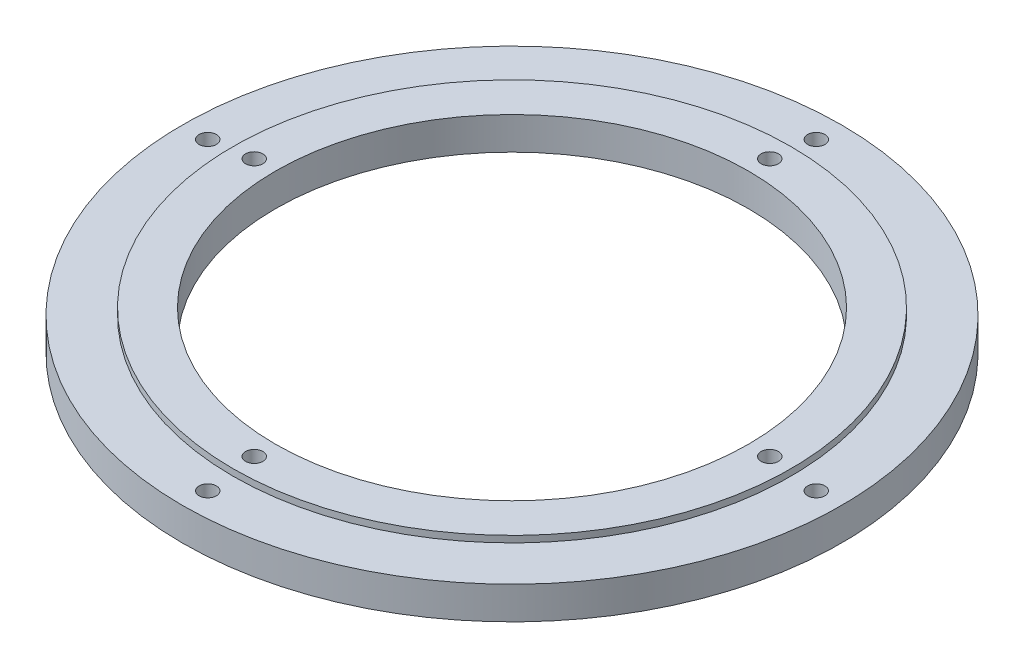
ISO-10303-21;
HEADER;
FILE_DESCRIPTION(('STEP AP214'),'2;1');
FILE_NAME('part.step','',(''),(''),'','','');
FILE_SCHEMA(('AUTOMOTIVE_DESIGN { 1 0 10303 214 1 1 1 1 }'));
ENDSEC;
DATA;
#1=APPLICATION_CONTEXT('core data for automotive mechanical design processes');
#2=APPLICATION_PROTOCOL_DEFINITION('international standard','automotive_design',2000,#1);
#3=PRODUCT_CONTEXT('',#1,'mechanical');
#4=PRODUCT('Part','Part','',(#3));
#5=PRODUCT_RELATED_PRODUCT_CATEGORY('part','',(#4));
#6=PRODUCT_DEFINITION_FORMATION('','',#4);
#7=PRODUCT_DEFINITION_CONTEXT('part definition',#1,'design');
#8=PRODUCT_DEFINITION('design','',#6,#7);
#9=PRODUCT_DEFINITION_SHAPE('','',#8);
#10=(LENGTH_UNIT() NAMED_UNIT(*) SI_UNIT(.MILLI.,.METRE.));
#11=(NAMED_UNIT(*) PLANE_ANGLE_UNIT() SI_UNIT($,.RADIAN.));
#12=(NAMED_UNIT(*) SI_UNIT($,.STERADIAN.) SOLID_ANGLE_UNIT());
#13=UNCERTAINTY_MEASURE_WITH_UNIT(LENGTH_MEASURE(1.E-05),#10,'distance_accuracy_value','');
#14=(GEOMETRIC_REPRESENTATION_CONTEXT(3) GLOBAL_UNCERTAINTY_ASSIGNED_CONTEXT((#13)) GLOBAL_UNIT_ASSIGNED_CONTEXT((#10,
#11,#12)) REPRESENTATION_CONTEXT('',''));
#15=CARTESIAN_POINT('',(0.,0.,0.));
#16=DIRECTION('',(0.,0.,1.));
#17=DIRECTION('',(1.,0.,0.));
#18=AXIS2_PLACEMENT_3D('',#15,#16,#17);
#19=CARTESIAN_POINT('',(0.,10.,0.));
#20=DIRECTION('',(0.,-1.,0.));
#21=DIRECTION('',(0.,0.,-1.));
#22=AXIS2_PLACEMENT_3D('',#19,#20,#21);
#23=CYLINDRICAL_SURFACE('',#22,85.5);
#24=CARTESIAN_POINT('',(0.,10.,0.));
#25=DIRECTION('',(0.,1.,0.));
#26=DIRECTION('',(0.,0.,1.));
#27=AXIS2_PLACEMENT_3D('',#24,#25,#26);
#28=CIRCLE('',#27,85.5);
#29=CARTESIAN_POINT('',(0.,10.,85.5));
#30=VERTEX_POINT('',#29);
#31=EDGE_CURVE('E53',#30,#30,#28,.T.);
#32=ORIENTED_EDGE('',*,*,#31,.F.);
#33=EDGE_LOOP('',(#32));
#34=FACE_BOUND('',#33,.T.);
#35=CARTESIAN_POINT('',(0.,8.,0.));
#36=DIRECTION('',(0.,-1.,0.));
#37=DIRECTION('',(0.,0.,-1.));
#38=AXIS2_PLACEMENT_3D('',#35,#36,#37);
#39=CIRCLE('',#38,85.5);
#40=CARTESIAN_POINT('',(0.,8.,-85.5));
#41=VERTEX_POINT('',#40);
#42=EDGE_CURVE('E10',#41,#41,#39,.T.);
#43=ORIENTED_EDGE('',*,*,#42,.F.);
#44=EDGE_LOOP('',(#43));
#45=FACE_BOUND('',#44,.T.);
#46=ADVANCED_FACE('F45',(#34,#45),#23,.T.);
#47=CARTESIAN_POINT('',(79.,10.,2.75827025768608E-13));
#48=DIRECTION('',(0.,-1.,0.));
#49=DIRECTION('',(0.,0.,-1.));
#50=AXIS2_PLACEMENT_3D('',#47,#48,#49);
#51=CYLINDRICAL_SURFACE('',#50,2.65);
#52=CARTESIAN_POINT('',(79.,10.,2.75827025768608E-13));
#53=DIRECTION('',(0.,1.,0.));
#54=DIRECTION('',(0.,0.,1.));
#55=AXIS2_PLACEMENT_3D('',#52,#53,#54);
#56=CIRCLE('',#55,2.65);
#57=CARTESIAN_POINT('',(79.,10.,2.65000000000027));
#58=VERTEX_POINT('',#57);
#59=EDGE_CURVE('E58',#58,#58,#56,.T.);
#60=ORIENTED_EDGE('',*,*,#59,.T.);
#61=EDGE_LOOP('',(#60));
#62=FACE_BOUND('',#61,.T.);
#63=CARTESIAN_POINT('',(79.,0.,2.75827025768608E-13));
#64=DIRECTION('',(0.,1.,0.));
#65=DIRECTION('',(0.,0.,1.));
#66=AXIS2_PLACEMENT_3D('',#63,#64,#65);
#67=CIRCLE('',#66,2.65);
#68=CARTESIAN_POINT('',(79.,0.,2.65000000000027));
#69=VERTEX_POINT('',#68);
#70=EDGE_CURVE('E85',#69,#69,#67,.T.);
#71=ORIENTED_EDGE('',*,*,#70,.F.);
#72=EDGE_LOOP('',(#71));
#73=FACE_BOUND('',#72,.T.);
#74=ADVANCED_FACE('F125',(#62,#73),#51,.F.);
#75=CARTESIAN_POINT('',(-5.51654051537215E-13,10.,79.));
#76=DIRECTION('',(0.,-1.,0.));
#77=DIRECTION('',(0.,0.,-1.));
#78=AXIS2_PLACEMENT_3D('',#75,#76,#77);
#79=CYLINDRICAL_SURFACE('',#78,2.65);
#80=CARTESIAN_POINT('',(-5.51654051537215E-13,10.,79.));
#81=DIRECTION('',(0.,1.,0.));
#82=DIRECTION('',(0.,0.,1.));
#83=AXIS2_PLACEMENT_3D('',#80,#81,#82);
#84=CIRCLE('',#83,2.65);
#85=CARTESIAN_POINT('',(-5.51654051537215E-13,10.,81.65));
#86=VERTEX_POINT('',#85);
#87=EDGE_CURVE('E64',#86,#86,#84,.T.);
#88=ORIENTED_EDGE('',*,*,#87,.T.);
#89=EDGE_LOOP('',(#88));
#90=FACE_BOUND('',#89,.T.);
#91=CARTESIAN_POINT('',(-5.51654051537215E-13,0.,79.));
#92=DIRECTION('',(0.,1.,0.));
#93=DIRECTION('',(0.,0.,1.));
#94=AXIS2_PLACEMENT_3D('',#91,#92,#93);
#95=CIRCLE('',#94,2.65);
#96=CARTESIAN_POINT('',(-5.51654051537215E-13,0.,81.65));
#97=VERTEX_POINT('',#96);
#98=EDGE_CURVE('E81',#97,#97,#95,.T.);
#99=ORIENTED_EDGE('',*,*,#98,.F.);
#100=EDGE_LOOP('',(#99));
#101=FACE_BOUND('',#100,.T.);
#102=ADVANCED_FACE('F114',(#90,#101),#79,.F.);
#103=CARTESIAN_POINT('',(-79.,10.,-8.27481077305823E-13));
#104=DIRECTION('',(0.,-1.,0.));
#105=DIRECTION('',(0.,0.,-1.));
#106=AXIS2_PLACEMENT_3D('',#103,#104,#105);
#107=CYLINDRICAL_SURFACE('',#106,2.65);
#108=CARTESIAN_POINT('',(-79.,10.,-8.27481077305823E-13));
#109=DIRECTION('',(0.,1.,0.));
#110=DIRECTION('',(0.,0.,1.));
#111=AXIS2_PLACEMENT_3D('',#108,#109,#110);
#112=CIRCLE('',#111,2.65);
#113=CARTESIAN_POINT('',(-79.,10.,2.64999999999917));
#114=VERTEX_POINT('',#113);
#115=EDGE_CURVE('E102',#114,#114,#112,.T.);
#116=ORIENTED_EDGE('',*,*,#115,.T.);
#117=EDGE_LOOP('',(#116));
#118=FACE_BOUND('',#117,.T.);
#119=CARTESIAN_POINT('',(-79.,0.,-8.27481077305823E-13));
#120=DIRECTION('',(0.,1.,0.));
#121=DIRECTION('',(0.,0.,1.));
#122=AXIS2_PLACEMENT_3D('',#119,#120,#121);
#123=CIRCLE('',#122,2.65);
#124=CARTESIAN_POINT('',(-79.,0.,2.64999999999917));
#125=VERTEX_POINT('',#124);
#126=EDGE_CURVE('E77',#125,#125,#123,.T.);
#127=ORIENTED_EDGE('',*,*,#126,.F.);
#128=EDGE_LOOP('',(#127));
#129=FACE_BOUND('',#128,.T.);
#130=ADVANCED_FACE('F152',(#118,#129),#107,.F.);
#131=CARTESIAN_POINT('',(0.,10.,-79.));
#132=DIRECTION('',(0.,-1.,0.));
#133=DIRECTION('',(0.,0.,-1.));
#134=AXIS2_PLACEMENT_3D('',#131,#132,#133);
#135=CYLINDRICAL_SURFACE('',#134,2.65);
#136=CARTESIAN_POINT('',(0.,10.,-79.));
#137=DIRECTION('',(0.,1.,0.));
#138=DIRECTION('',(0.,0.,1.));
#139=AXIS2_PLACEMENT_3D('',#136,#137,#138);
#140=CIRCLE('',#139,2.65);
#141=CARTESIAN_POINT('',(0.,10.,-76.35));
#142=VERTEX_POINT('',#141);
#143=EDGE_CURVE('E96',#142,#142,#140,.T.);
#144=ORIENTED_EDGE('',*,*,#143,.T.);
#145=EDGE_LOOP('',(#144));
#146=FACE_BOUND('',#145,.T.);
#147=CARTESIAN_POINT('',(0.,0.,-79.));
#148=DIRECTION('',(0.,1.,0.));
#149=DIRECTION('',(0.,0.,1.));
#150=AXIS2_PLACEMENT_3D('',#147,#148,#149);
#151=CIRCLE('',#150,2.65);
#152=CARTESIAN_POINT('',(0.,0.,-76.35));
#153=VERTEX_POINT('',#152);
#154=EDGE_CURVE('E72',#153,#153,#151,.T.);
#155=ORIENTED_EDGE('',*,*,#154,.F.);
#156=EDGE_LOOP('',(#155));
#157=FACE_BOUND('',#156,.T.);
#158=ADVANCED_FACE('F154',(#146,#157),#135,.F.);
#159=CARTESIAN_POINT('',(0.,10.,0.));
#160=DIRECTION('',(0.,-1.,0.));
#161=DIRECTION('',(0.,0.,-1.));
#162=AXIS2_PLACEMENT_3D('',#159,#160,#161);
#163=CYLINDRICAL_SURFACE('',#162,72.5);
#164=CARTESIAN_POINT('',(0.,10.,0.));
#165=DIRECTION('',(0.,1.,0.));
#166=DIRECTION('',(0.,0.,1.));
#167=AXIS2_PLACEMENT_3D('',#164,#165,#166);
#168=CIRCLE('',#167,72.5);
#169=CARTESIAN_POINT('',(0.,10.,72.5));
#170=VERTEX_POINT('',#169);
#171=EDGE_CURVE('E91',#170,#170,#168,.T.);
#172=ORIENTED_EDGE('',*,*,#171,.T.);
#173=EDGE_LOOP('',(#172));
#174=FACE_BOUND('',#173,.T.);
#175=CARTESIAN_POINT('',(0.,0.,0.));
#176=DIRECTION('',(0.,1.,0.));
#177=DIRECTION('',(0.,0.,1.));
#178=AXIS2_PLACEMENT_3D('',#175,#176,#177);
#179=CIRCLE('',#178,72.5);
#180=CARTESIAN_POINT('',(0.,0.,72.5));
#181=VERTEX_POINT('',#180);
#182=EDGE_CURVE('E68',#181,#181,#179,.T.);
#183=ORIENTED_EDGE('',*,*,#182,.F.);
#184=EDGE_LOOP('',(#183));
#185=FACE_BOUND('',#184,.T.);
#186=ADVANCED_FACE('F47',(#174,#185),#163,.F.);
#187=CARTESIAN_POINT('',(0.,10.,0.));
#188=DIRECTION('',(0.,1.,0.));
#189=DIRECTION('',(0.,0.,1.));
#190=AXIS2_PLACEMENT_3D('',#187,#188,#189);
#191=PLANE('',#190);
#192=ORIENTED_EDGE('',*,*,#171,.F.);
#193=EDGE_LOOP('',(#192));
#194=FACE_BOUND('',#193,.T.);
#195=ORIENTED_EDGE('',*,*,#143,.F.);
#196=EDGE_LOOP('',(#195));
#197=FACE_BOUND('',#196,.T.);
#198=ORIENTED_EDGE('',*,*,#115,.F.);
#199=EDGE_LOOP('',(#198));
#200=FACE_BOUND('',#199,.T.);
#201=ORIENTED_EDGE('',*,*,#87,.F.);
#202=EDGE_LOOP('',(#201));
#203=FACE_BOUND('',#202,.T.);
#204=ORIENTED_EDGE('',*,*,#59,.F.);
#205=EDGE_LOOP('',(#204));
#206=FACE_BOUND('',#205,.T.);
#207=ORIENTED_EDGE('',*,*,#31,.T.);
#208=EDGE_LOOP('',(#207));
#209=FACE_BOUND('',#208,.T.);
#210=ADVANCED_FACE('F117',(#194,#197,#200,#203,#206,#209),#191,.T.);
#211=CARTESIAN_POINT('',(0.,0.,0.));
#212=DIRECTION('',(0.,1.,0.));
#213=DIRECTION('',(0.,0.,1.));
#214=AXIS2_PLACEMENT_3D('',#211,#212,#213);
#215=PLANE('',#214);
#216=ORIENTED_EDGE('',*,*,#182,.T.);
#217=EDGE_LOOP('',(#216));
#218=FACE_BOUND('',#217,.T.);
#219=ORIENTED_EDGE('',*,*,#154,.T.);
#220=EDGE_LOOP('',(#219));
#221=FACE_BOUND('',#220,.T.);
#222=ORIENTED_EDGE('',*,*,#126,.T.);
#223=EDGE_LOOP('',(#222));
#224=FACE_BOUND('',#223,.T.);
#225=ORIENTED_EDGE('',*,*,#98,.T.);
#226=EDGE_LOOP('',(#225));
#227=FACE_BOUND('',#226,.T.);
#228=ORIENTED_EDGE('',*,*,#70,.T.);
#229=EDGE_LOOP('',(#228));
#230=FACE_BOUND('',#229,.T.);
#231=CARTESIAN_POINT('',(0.,0.,0.));
#232=DIRECTION('',(0.,1.,0.));
#233=DIRECTION('',(0.,0.,1.));
#234=AXIS2_PLACEMENT_3D('',#231,#232,#233);
#235=CIRCLE('',#234,85.5);
#236=CARTESIAN_POINT('',(0.,0.,85.5));
#237=VERTEX_POINT('',#236);
#238=EDGE_CURVE('E88',#237,#237,#235,.T.);
#239=ORIENTED_EDGE('',*,*,#238,.F.);
#240=EDGE_LOOP('',(#239));
#241=FACE_BOUND('',#240,.T.);
#242=ADVANCED_FACE('F120',(#218,#221,#224,#227,#230,#241),#215,.F.);
#243=CARTESIAN_POINT('',(0.,8.,0.));
#244=DIRECTION('',(0.,-1.,0.));
#245=DIRECTION('',(0.,0.,-1.));
#246=AXIS2_PLACEMENT_3D('',#243,#244,#245);
#247=CYLINDRICAL_SURFACE('',#246,85.5);
#248=CARTESIAN_POINT('',(0.,-2.,0.));
#249=DIRECTION('',(0.,-1.,0.));
#250=DIRECTION('',(0.,0.,-1.));
#251=AXIS2_PLACEMENT_3D('',#248,#249,#250);
#252=CIRCLE('',#251,85.5);
#253=CARTESIAN_POINT('',(0.,-2.,-85.5));
#254=VERTEX_POINT('',#253);
#255=EDGE_CURVE('E105',#254,#254,#252,.T.);
#256=ORIENTED_EDGE('',*,*,#255,.T.);
#257=EDGE_LOOP('',(#256));
#258=FACE_BOUND('',#257,.T.);
#259=ORIENTED_EDGE('',*,*,#238,.T.);
#260=EDGE_LOOP('',(#259));
#261=FACE_BOUND('',#260,.T.);
#262=ADVANCED_FACE('F133',(#258,#261),#247,.F.);
#263=CARTESIAN_POINT('',(-93.25,8.,3.25580634847122E-13));
#264=DIRECTION('',(0.,-1.,0.));
#265=DIRECTION('',(0.,0.,-1.));
#266=AXIS2_PLACEMENT_3D('',#263,#264,#265);
#267=CYLINDRICAL_SURFACE('',#266,2.65);
#268=CARTESIAN_POINT('',(-93.25,8.,3.25580634847122E-13));
#269=DIRECTION('',(0.,-1.,0.));
#270=DIRECTION('',(0.,0.,-1.));
#271=AXIS2_PLACEMENT_3D('',#268,#269,#270);
#272=CIRCLE('',#271,2.65);
#273=CARTESIAN_POINT('',(-93.25,8.,-2.64999999999967));
#274=VERTEX_POINT('',#273);
#275=EDGE_CURVE('E73',#274,#274,#272,.T.);
#276=ORIENTED_EDGE('',*,*,#275,.F.);
#277=EDGE_LOOP('',(#276));
#278=FACE_BOUND('',#277,.T.);
#279=CARTESIAN_POINT('',(-93.25,-2.,3.25580634847122E-13));
#280=DIRECTION('',(0.,-1.,0.));
#281=DIRECTION('',(0.,0.,-1.));
#282=AXIS2_PLACEMENT_3D('',#279,#280,#281);
#283=CIRCLE('',#282,2.65);
#284=CARTESIAN_POINT('',(-93.25,-2.,-2.64999999999967));
#285=VERTEX_POINT('',#284);
#286=EDGE_CURVE('E287',#285,#285,#283,.T.);
#287=ORIENTED_EDGE('',*,*,#286,.T.);
#288=EDGE_LOOP('',(#287));
#289=FACE_BOUND('',#288,.T.);
#290=ADVANCED_FACE('F140',(#278,#289),#267,.F.);
#291=CARTESIAN_POINT('',(6.51161269694244E-13,8.,93.25));
#292=DIRECTION('',(0.,-1.,0.));
#293=DIRECTION('',(0.,0.,-1.));
#294=AXIS2_PLACEMENT_3D('',#291,#292,#293);
#295=CYLINDRICAL_SURFACE('',#294,2.65);
#296=CARTESIAN_POINT('',(6.51161269694244E-13,8.,93.25));
#297=DIRECTION('',(0.,-1.,0.));
#298=DIRECTION('',(0.,0.,-1.));
#299=AXIS2_PLACEMENT_3D('',#296,#297,#298);
#300=CIRCLE('',#299,2.65);
#301=CARTESIAN_POINT('',(6.51161269694244E-13,8.,90.6));
#302=VERTEX_POINT('',#301);
#303=EDGE_CURVE('E310',#302,#302,#300,.T.);
#304=ORIENTED_EDGE('',*,*,#303,.F.);
#305=EDGE_LOOP('',(#304));
#306=FACE_BOUND('',#305,.T.);
#307=CARTESIAN_POINT('',(6.51161269694244E-13,-2.,93.25));
#308=DIRECTION('',(0.,-1.,0.));
#309=DIRECTION('',(0.,0.,-1.));
#310=AXIS2_PLACEMENT_3D('',#307,#308,#309);
#311=CIRCLE('',#310,2.65);
#312=CARTESIAN_POINT('',(6.51161269694244E-13,-2.,90.6));
#313=VERTEX_POINT('',#312);
#314=EDGE_CURVE('E283',#313,#313,#311,.T.);
#315=ORIENTED_EDGE('',*,*,#314,.T.);
#316=EDGE_LOOP('',(#315));
#317=FACE_BOUND('',#316,.T.);
#318=ADVANCED_FACE('F205',(#306,#317),#295,.F.);
#319=CARTESIAN_POINT('',(93.25,8.,-9.76741904541367E-13));
#320=DIRECTION('',(0.,-1.,0.));
#321=DIRECTION('',(0.,0.,-1.));
#322=AXIS2_PLACEMENT_3D('',#319,#320,#321);
#323=CYLINDRICAL_SURFACE('',#322,2.65);
#324=CARTESIAN_POINT('',(93.25,8.,-9.76741904541367E-13));
#325=DIRECTION('',(0.,-1.,0.));
#326=DIRECTION('',(0.,0.,-1.));
#327=AXIS2_PLACEMENT_3D('',#324,#325,#326);
#328=CIRCLE('',#327,2.65);
#329=CARTESIAN_POINT('',(93.25,8.,-2.65000000000098));
#330=VERTEX_POINT('',#329);
#331=EDGE_CURVE('E314',#330,#330,#328,.T.);
#332=ORIENTED_EDGE('',*,*,#331,.F.);
#333=EDGE_LOOP('',(#332));
#334=FACE_BOUND('',#333,.T.);
#335=CARTESIAN_POINT('',(93.25,-2.,-9.76741904541367E-13));
#336=DIRECTION('',(0.,-1.,0.));
#337=DIRECTION('',(0.,0.,-1.));
#338=AXIS2_PLACEMENT_3D('',#335,#336,#337);
#339=CIRCLE('',#338,2.65);
#340=CARTESIAN_POINT('',(93.25,-2.,-2.65000000000098));
#341=VERTEX_POINT('',#340);
#342=EDGE_CURVE('E279',#341,#341,#339,.T.);
#343=ORIENTED_EDGE('',*,*,#342,.T.);
#344=EDGE_LOOP('',(#343));
#345=FACE_BOUND('',#344,.T.);
#346=ADVANCED_FACE('F215',(#334,#345),#323,.F.);
#347=CARTESIAN_POINT('',(0.,8.,-93.25));
#348=DIRECTION('',(0.,-1.,0.));
#349=DIRECTION('',(0.,0.,-1.));
#350=AXIS2_PLACEMENT_3D('',#347,#348,#349);
#351=CYLINDRICAL_SURFACE('',#350,2.65);
#352=CARTESIAN_POINT('',(0.,8.,-93.25));
#353=DIRECTION('',(0.,-1.,0.));
#354=DIRECTION('',(0.,0.,-1.));
#355=AXIS2_PLACEMENT_3D('',#352,#353,#354);
#356=CIRCLE('',#355,2.65);
#357=CARTESIAN_POINT('',(0.,8.,-95.9));
#358=VERTEX_POINT('',#357);
#359=EDGE_CURVE('E295',#358,#358,#356,.T.);
#360=ORIENTED_EDGE('',*,*,#359,.F.);
#361=EDGE_LOOP('',(#360));
#362=FACE_BOUND('',#361,.T.);
#363=CARTESIAN_POINT('',(0.,-2.,-93.25));
#364=DIRECTION('',(0.,-1.,0.));
#365=DIRECTION('',(0.,0.,-1.));
#366=AXIS2_PLACEMENT_3D('',#363,#364,#365);
#367=CIRCLE('',#366,2.65);
#368=CARTESIAN_POINT('',(0.,-2.,-95.9));
#369=VERTEX_POINT('',#368);
#370=EDGE_CURVE('E275',#369,#369,#367,.T.);
#371=ORIENTED_EDGE('',*,*,#370,.T.);
#372=EDGE_LOOP('',(#371));
#373=FACE_BOUND('',#372,.T.);
#374=ADVANCED_FACE('F225',(#362,#373),#351,.F.);
#375=CARTESIAN_POINT('',(0.,8.,0.));
#376=DIRECTION('',(0.,-1.,0.));
#377=DIRECTION('',(0.,0.,-1.));
#378=AXIS2_PLACEMENT_3D('',#375,#376,#377);
#379=CYLINDRICAL_SURFACE('',#378,101.);
#380=CARTESIAN_POINT('',(0.,8.,0.));
#381=DIRECTION('',(0.,-1.,0.));
#382=DIRECTION('',(0.,0.,-1.));
#383=AXIS2_PLACEMENT_3D('',#380,#381,#382);
#384=CIRCLE('',#383,101.);
#385=CARTESIAN_POINT('',(0.,8.,-101.));
#386=VERTEX_POINT('',#385);
#387=EDGE_CURVE('E291',#386,#386,#384,.T.);
#388=ORIENTED_EDGE('',*,*,#387,.T.);
#389=EDGE_LOOP('',(#388));
#390=FACE_BOUND('',#389,.T.);
#391=CARTESIAN_POINT('',(0.,-2.,0.));
#392=DIRECTION('',(0.,-1.,0.));
#393=DIRECTION('',(0.,0.,-1.));
#394=AXIS2_PLACEMENT_3D('',#391,#392,#393);
#395=CIRCLE('',#394,101.);
#396=CARTESIAN_POINT('',(0.,-2.,-101.));
#397=VERTEX_POINT('',#396);
#398=EDGE_CURVE('E271',#397,#397,#395,.T.);
#399=ORIENTED_EDGE('',*,*,#398,.F.);
#400=EDGE_LOOP('',(#399));
#401=FACE_BOUND('',#400,.T.);
#402=ADVANCED_FACE('F235',(#390,#401),#379,.T.);
#403=CARTESIAN_POINT('',(0.,8.,0.));
#404=DIRECTION('',(0.,-1.,0.));
#405=DIRECTION('',(0.,0.,-1.));
#406=AXIS2_PLACEMENT_3D('',#403,#404,#405);
#407=PLANE('',#406);
#408=ORIENTED_EDGE('',*,*,#387,.F.);
#409=EDGE_LOOP('',(#408));
#410=FACE_BOUND('',#409,.T.);
#411=ORIENTED_EDGE('',*,*,#359,.T.);
#412=EDGE_LOOP('',(#411));
#413=FACE_BOUND('',#412,.T.);
#414=ORIENTED_EDGE('',*,*,#331,.T.);
#415=EDGE_LOOP('',(#414));
#416=FACE_BOUND('',#415,.T.);
#417=ORIENTED_EDGE('',*,*,#303,.T.);
#418=EDGE_LOOP('',(#417));
#419=FACE_BOUND('',#418,.T.);
#420=ORIENTED_EDGE('',*,*,#275,.T.);
#421=EDGE_LOOP('',(#420));
#422=FACE_BOUND('',#421,.T.);
#423=ORIENTED_EDGE('',*,*,#42,.T.);
#424=EDGE_LOOP('',(#423));
#425=FACE_BOUND('',#424,.T.);
#426=ADVANCED_FACE('F245',(#410,#413,#416,#419,#422,#425),#407,.F.);
#427=CARTESIAN_POINT('',(0.,-2.,0.));
#428=DIRECTION('',(0.,-1.,0.));
#429=DIRECTION('',(0.,0.,-1.));
#430=AXIS2_PLACEMENT_3D('',#427,#428,#429);
#431=PLANE('',#430);
#432=ORIENTED_EDGE('',*,*,#398,.T.);
#433=EDGE_LOOP('',(#432));
#434=FACE_BOUND('',#433,.T.);
#435=ORIENTED_EDGE('',*,*,#370,.F.);
#436=EDGE_LOOP('',(#435));
#437=FACE_BOUND('',#436,.T.);
#438=ORIENTED_EDGE('',*,*,#342,.F.);
#439=EDGE_LOOP('',(#438));
#440=FACE_BOUND('',#439,.T.);
#441=ORIENTED_EDGE('',*,*,#314,.F.);
#442=EDGE_LOOP('',(#441));
#443=FACE_BOUND('',#442,.T.);
#444=ORIENTED_EDGE('',*,*,#286,.F.);
#445=EDGE_LOOP('',(#444));
#446=FACE_BOUND('',#445,.T.);
#447=ORIENTED_EDGE('',*,*,#255,.F.);
#448=EDGE_LOOP('',(#447));
#449=FACE_BOUND('',#448,.T.);
#450=ADVANCED_FACE('F255',(#434,#437,#440,#443,#446,#449),#431,.T.);
#451=CLOSED_SHELL('',(#46,#74,#102,#130,#158,#186,#210,#242,#262,#290,#318,#346,#374,#402,#426,#450));
#452=MANIFOLD_SOLID_BREP('B2',#451);
#453=ADVANCED_BREP_SHAPE_REPRESENTATION('',(#18,#452),#14);
#454=SHAPE_DEFINITION_REPRESENTATION(#9,#453);
ENDSEC;
END-ISO-10303-21;
